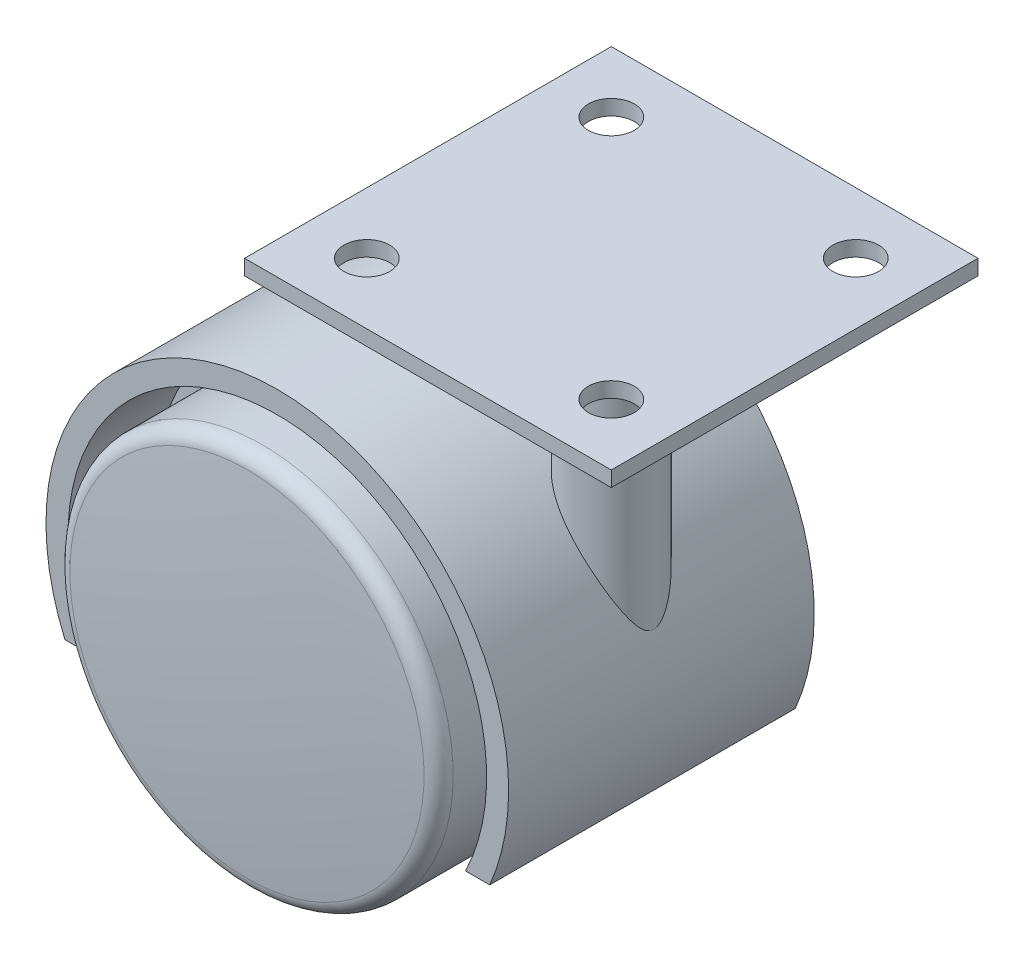
ISO-10303-21;
HEADER;
FILE_DESCRIPTION(('STEP AP214'),'2;1');
FILE_NAME('part.step','',(''),(''),'','','');
FILE_SCHEMA(('AUTOMOTIVE_DESIGN { 1 0 10303 214 1 1 1 1 }'));
ENDSEC;
DATA;
#1=APPLICATION_CONTEXT('core data for automotive mechanical design processes');
#2=APPLICATION_PROTOCOL_DEFINITION('international standard','automotive_design',2000,#1);
#3=PRODUCT_CONTEXT('',#1,'mechanical');
#4=PRODUCT('Part','Part','',(#3));
#5=PRODUCT_RELATED_PRODUCT_CATEGORY('part','',(#4));
#6=PRODUCT_DEFINITION_FORMATION('','',#4);
#7=PRODUCT_DEFINITION_CONTEXT('part definition',#1,'design');
#8=PRODUCT_DEFINITION('design','',#6,#7);
#9=PRODUCT_DEFINITION_SHAPE('','',#8);
#10=(LENGTH_UNIT() NAMED_UNIT(*) SI_UNIT(.MILLI.,.METRE.));
#11=(NAMED_UNIT(*) PLANE_ANGLE_UNIT() SI_UNIT($,.RADIAN.));
#12=(NAMED_UNIT(*) SI_UNIT($,.STERADIAN.) SOLID_ANGLE_UNIT());
#13=UNCERTAINTY_MEASURE_WITH_UNIT(LENGTH_MEASURE(1.E-05),#10,'distance_accuracy_value','');
#14=(GEOMETRIC_REPRESENTATION_CONTEXT(3) GLOBAL_UNCERTAINTY_ASSIGNED_CONTEXT((#13)) GLOBAL_UNIT_ASSIGNED_CONTEXT((#10,
#11,#12)) REPRESENTATION_CONTEXT('',''));
#15=CARTESIAN_POINT('',(0.,0.,0.));
#16=DIRECTION('',(0.,0.,1.));
#17=DIRECTION('',(1.,0.,0.));
#18=AXIS2_PLACEMENT_3D('',#15,#16,#17);
#19=CARTESIAN_POINT('',(0.,4.7625,-6.731));
#20=DIRECTION('',(0.,0.,-1.));
#21=DIRECTION('',(0.,1.,0.));
#22=AXIS2_PLACEMENT_3D('',#19,#20,#21);
#23=PLANE('',#22);
#24=CARTESIAN_POINT('',(0.,0.,-6.731));
#25=DIRECTION('',(0.,0.,-1.));
#26=DIRECTION('',(0.,1.,0.));
#27=AXIS2_PLACEMENT_3D('',#24,#25,#26);
#28=CIRCLE('',#27,21.74875);
#29=CARTESIAN_POINT('',(19.5520459687087,-9.52500000000001,-6.731));
#30=VERTEX_POINT('',#29);
#31=CARTESIAN_POINT('',(-19.5520459687088,-9.525,-6.731));
#32=VERTEX_POINT('',#31);
#33=EDGE_CURVE('E136',#30,#32,#28,.F.);
#34=ORIENTED_EDGE('',*,*,#33,.F.);
#35=DIRECTION('',(1.,0.,0.));
#36=VECTOR('',#35,1.);
#37=CARTESIAN_POINT('',(-19.5520459687088,-9.525,-6.731));
#38=LINE('',#37,#36);
#39=EDGE_CURVE('E129',#32,#30,#38,.T.);
#40=ORIENTED_EDGE('',*,*,#39,.F.);
#41=EDGE_LOOP('',(#34,#40));
#42=FACE_BOUND('',#41,.T.);
#43=CARTESIAN_POINT('',(0.,0.,-6.731));
#44=DIRECTION('',(0.,0.,-1.));
#45=DIRECTION('',(0.,1.,0.));
#46=AXIS2_PLACEMENT_3D('',#43,#44,#45);
#47=CIRCLE('',#46,4.7625);
#48=CARTESIAN_POINT('',(0.,4.7625,-6.731));
#49=VERTEX_POINT('',#48);
#50=EDGE_CURVE('E438',#49,#49,#47,.F.);
#51=ORIENTED_EDGE('',*,*,#50,.T.);
#52=EDGE_LOOP('',(#51));
#53=FACE_BOUND('',#52,.T.);
#54=ADVANCED_FACE('F48',(#42,#53),#23,.T.);
#55=CARTESIAN_POINT('',(0.,4.7625,6.731));
#56=DIRECTION('',(0.,0.,1.));
#57=DIRECTION('',(0.,-1.,0.));
#58=AXIS2_PLACEMENT_3D('',#55,#56,#57);
#59=PLANE('',#58);
#60=DIRECTION('',(1.,0.,0.));
#61=VECTOR('',#60,1.);
#62=CARTESIAN_POINT('',(-19.5520459687088,-9.525,6.731));
#63=LINE('',#62,#61);
#64=CARTESIAN_POINT('',(-19.5520459687088,-9.525,6.731));
#65=VERTEX_POINT('',#64);
#66=CARTESIAN_POINT('',(19.5520459687088,-9.52500000000001,6.731));
#67=VERTEX_POINT('',#66);
#68=EDGE_CURVE('E64',#65,#67,#63,.T.);
#69=ORIENTED_EDGE('',*,*,#68,.T.);
#70=CARTESIAN_POINT('',(0.,0.,6.731));
#71=DIRECTION('',(0.,0.,1.));
#72=DIRECTION('',(0.,-1.,0.));
#73=AXIS2_PLACEMENT_3D('',#70,#71,#72);
#74=CIRCLE('',#73,21.74875);
#75=EDGE_CURVE('E139',#67,#65,#74,.T.);
#76=ORIENTED_EDGE('',*,*,#75,.T.);
#77=EDGE_LOOP('',(#69,#76));
#78=FACE_BOUND('',#77,.T.);
#79=CARTESIAN_POINT('',(0.,0.,6.731));
#80=DIRECTION('',(0.,0.,1.));
#81=DIRECTION('',(0.,-1.,0.));
#82=AXIS2_PLACEMENT_3D('',#79,#80,#81);
#83=CIRCLE('',#82,4.7625);
#84=CARTESIAN_POINT('',(0.,-4.7625,6.731));
#85=VERTEX_POINT('',#84);
#86=EDGE_CURVE('E52',#85,#85,#83,.F.);
#87=ORIENTED_EDGE('',*,*,#86,.T.);
#88=EDGE_LOOP('',(#87));
#89=FACE_BOUND('',#88,.T.);
#90=ADVANCED_FACE('F172',(#78,#89),#59,.T.);
#91=CARTESIAN_POINT('',(18.82775,-19.84375,0.));
#92=DIRECTION('',(0.,-1.,0.));
#93=DIRECTION('',(0.,0.,-1.));
#94=AXIS2_PLACEMENT_3D('',#91,#92,#93);
#95=CYLINDRICAL_SURFACE('',#94,4.41325);
#96=CARTESIAN_POINT('',(18.82775,24.03475,0.));
#97=DIRECTION('',(0.,-1.,0.));
#98=DIRECTION('',(0.,0.,-1.));
#99=AXIS2_PLACEMENT_3D('',#96,#97,#98);
#100=CIRCLE('',#99,4.41325);
#101=CARTESIAN_POINT('',(18.82775,24.03475,-4.41325));
#102=VERTEX_POINT('',#101);
#103=EDGE_CURVE('E13',#102,#102,#100,.T.);
#104=ORIENTED_EDGE('',*,*,#103,.T.);
#105=EDGE_LOOP('',(#104));
#106=FACE_BOUND('',#105,.T.);
#107=CARTESIAN_POINT('',(18.82775,14.9393787521436,-4.41325));
#108=CARTESIAN_POINT('',(18.6735046556456,15.1337735249611,-4.41324708585515));
#109=CARTESIAN_POINT('',(18.516246833289,15.3257672803091,-4.4051749356869));
#110=CARTESIAN_POINT('',(18.1966337153172,15.703915800008,-4.37084755866677));
#111=CARTESIAN_POINT('',(18.0342779444308,15.8900700166975,-4.34459063165228));
#112=CARTESIAN_POINT('',(17.7064194757687,16.2545932862547,-4.27170982803758));
#113=CARTESIAN_POINT('',(17.5409273412617,16.4329834681052,-4.22514559635213));
#114=CARTESIAN_POINT('',(17.2085684956669,16.7807090296801,-4.10925552655094));
#115=CARTESIAN_POINT('',(17.0417028391793,16.9500507222742,-4.03994580492532));
#116=CARTESIAN_POINT('',(16.6774440408704,17.3092239499279,-3.86027477266318));
#117=CARTESIAN_POINT('',(16.4803349134141,17.4967549479172,-3.74458919594053));
#118=CARTESIAN_POINT('',(16.0953214371942,17.8515610490821,-3.47360247240316));
#119=CARTESIAN_POINT('',(15.9074068999939,18.0188588896441,-3.31834641521977));
#120=CARTESIAN_POINT('',(15.5795600222954,18.3026114624611,-2.9949761116742));
#121=CARTESIAN_POINT('',(15.4368166425068,18.4229036639546,-2.83316449610304));
#122=CARTESIAN_POINT('',(15.2377537278681,18.5872952816025,-2.56922086713555));
#123=CARTESIAN_POINT('',(15.1738814813439,18.6394388932609,-2.47765363539196));
#124=CARTESIAN_POINT('',(15.0520728218772,18.7379408534333,-2.28773753491972));
#125=CARTESIAN_POINT('',(14.9941337072346,18.78430183723,-2.18939178728408));
#126=CARTESIAN_POINT('',(14.8846359213459,18.8711885493543,-1.98548162594045));
#127=CARTESIAN_POINT('',(14.8331369031895,18.911660219609,-1.87986203430008));
#128=CARTESIAN_POINT('',(14.7380598081905,18.9858483437695,-1.66289714402008));
#129=CARTESIAN_POINT('',(14.6944776493467,19.0195682798503,-1.55155483427634));
#130=CARTESIAN_POINT('',(14.6160681970723,19.0798901471695,-1.3240046637402));
#131=CARTESIAN_POINT('',(14.5812377031941,19.1064946807109,-1.20779859979142));
#132=CARTESIAN_POINT('',(14.5210416806434,19.1522842454316,-0.971540599066324));
#133=CARTESIAN_POINT('',(14.495674538441,19.171470541463,-0.851489321704218));
#134=CARTESIAN_POINT('',(14.4578029201212,19.200042165769,-0.625737868752808));
#135=CARTESIAN_POINT('',(14.4439954579538,19.2104231235414,-0.520379568854183));
#136=CARTESIAN_POINT('',(14.4240135884359,19.2254310227401,-0.308538395085992));
#137=CARTESIAN_POINT('',(14.417838436075,19.230058525777,-0.202055632001834));
#138=CARTESIAN_POINT('',(14.4132267892254,19.2335152580596,0.0111285300789549));
#139=CARTESIAN_POINT('',(14.4147872619401,19.2323467596611,0.117829827000257));
#140=CARTESIAN_POINT('',(14.4256122070131,19.2242286042939,0.330617357755637));
#141=CARTESIAN_POINT('',(14.4348765238121,19.2172790640586,0.436703603965533));
#142=CARTESIAN_POINT('',(14.4600978824864,19.198307428978,0.640488369889694));
#143=CARTESIAN_POINT('',(14.4755756009996,19.1866483125453,0.738280308105837));
#144=CARTESIAN_POINT('',(14.512890100413,19.1584385503763,0.931934866181304));
#145=CARTESIAN_POINT('',(14.5347288955178,19.1418863552452,1.02779686463945));
#146=CARTESIAN_POINT('',(14.6093453984774,19.085077897831,1.31147061113141));
#147=CARTESIAN_POINT('',(14.6712487231738,19.0376509485245,1.49557013319889));
#148=CARTESIAN_POINT('',(14.8186278995268,18.9231711192496,1.85551132166329));
#149=CARTESIAN_POINT('',(14.9048506412693,18.8554913932126,2.03084098379151));
#150=CARTESIAN_POINT('',(15.0955907721381,18.7031340513818,2.36315267831197));
#151=CARTESIAN_POINT('',(15.2001141386345,18.6184508805735,2.52012868798925));
#152=CARTESIAN_POINT('',(15.4363746500406,18.4231833810191,2.83160667994795));
#153=CARTESIAN_POINT('',(15.5698707434623,18.3107143653123,2.98357983346428));
#154=CARTESIAN_POINT('',(15.8486649232616,18.0699459749271,3.26200886759862));
#155=CARTESIAN_POINT('',(15.993970938328,17.9416359347451,3.38844740353594));
#156=CARTESIAN_POINT('',(16.2572175440304,17.7029956114396,3.59026091241001));
#157=CARTESIAN_POINT('',(16.3737618513782,17.5953213724824,3.67069125042706));
#158=CARTESIAN_POINT('',(16.609244262768,17.3732093074563,3.81762652718935));
#159=CARTESIAN_POINT('',(16.7281833430695,17.2587686845998,3.88412565534085));
#160=CARTESIAN_POINT('',(16.9671087197422,17.0239401223274,4.00408424302384));
#161=CARTESIAN_POINT('',(17.0870963275903,16.9035434522117,4.05752383458586));
#162=CARTESIAN_POINT('',(17.3268003865907,16.6577518626752,4.15217228584777));
#163=CARTESIAN_POINT('',(17.4465167453595,16.5323554512051,4.1933774630288));
#164=CARTESIAN_POINT('',(17.7371931412647,16.2211060582015,4.28013175812443));
#165=CARTESIAN_POINT('',(17.907507060681,16.0329439159287,4.31960530522012));
#166=CARTESIAN_POINT('',(18.2435841090729,15.6494713576666,4.37774235603696));
#167=CARTESIAN_POINT('',(18.4093451949686,15.4541578213401,4.39639666129076));
#168=CARTESIAN_POINT('',(18.7352298899271,15.0574362411102,4.41530340572104));
#169=CARTESIAN_POINT('',(18.8953420355737,14.8560171915715,4.41552036093794));
#170=CARTESIAN_POINT('',(19.2086726228371,14.4486052621944,4.39957673731767));
#171=CARTESIAN_POINT('',(19.361891322382,14.2426125539174,4.38341677177943));
#172=CARTESIAN_POINT('',(19.7341935274965,13.725023162418,4.32504738390753));
#173=CARTESIAN_POINT('',(19.9487513174535,13.4111526993785,4.27395232328723));
#174=CARTESIAN_POINT('',(20.3603768422247,12.7776047638049,4.144204237535));
#175=CARTESIAN_POINT('',(20.5574341114991,12.4579239524245,4.06553485984841));
#176=CARTESIAN_POINT('',(20.9334104318532,11.8152433215256,3.88413397090499));
#177=CARTESIAN_POINT('',(21.1123470192469,11.4922470505717,3.78142604804404));
#178=CARTESIAN_POINT('',(21.452138917185,10.8447484330944,3.55403299113083));
#179=CARTESIAN_POINT('',(21.6130029924446,10.5202468967943,3.42935858627715));
#180=CARTESIAN_POINT('',(21.9024372204973,9.90239870024276,3.17129004768739));
#181=CARTESIAN_POINT('',(22.0326224314235,9.60900323294124,3.03983057108179));
#182=CARTESIAN_POINT('',(22.2168104132924,9.17102498840972,2.82838396560864));
#183=CARTESIAN_POINT('',(22.2763813967596,9.02532235377414,2.7554910164008));
#184=CARTESIAN_POINT('',(22.3917673886692,8.73512004893267,2.60453316890754));
#185=CARTESIAN_POINT('',(22.4475828024809,8.59062025037499,2.52646883062341));
#186=CARTESIAN_POINT('',(22.5546563539298,8.30539423471869,2.36561944160848));
#187=CARTESIAN_POINT('',(22.6059659102418,8.16464341227471,2.28291249961409));
#188=CARTESIAN_POINT('',(22.7047152434426,7.88587071180598,2.11086762126114));
#189=CARTESIAN_POINT('',(22.7521557828907,7.74784830011098,2.02153099823335));
#190=CARTESIAN_POINT('',(22.8428922450174,7.47609421147965,1.83472098362518));
#191=CARTESIAN_POINT('',(22.8861905211714,7.34236012714328,1.73725227203422));
#192=CARTESIAN_POINT('',(22.9681317805201,7.08185412532185,1.53175598942313));
#193=CARTESIAN_POINT('',(23.0067813952262,6.95507243397302,1.42374386755769));
#194=CARTESIAN_POINT('',(23.0716687038811,6.73630481125984,1.21472619030601));
#195=CARTESIAN_POINT('',(23.0988743908869,6.64225469532848,1.11621168716088));
#196=CARTESIAN_POINT('',(23.148241103756,6.46809006911075,0.906471098438803));
#197=CARTESIAN_POINT('',(23.1704248338218,6.38791324222358,0.795305782171558));
#198=CARTESIAN_POINT('',(23.1986367993613,6.28441663682708,0.613315538952055));
#199=CARTESIAN_POINT('',(23.2073558985194,6.25209232762389,0.548112050894086));
#200=CARTESIAN_POINT('',(23.2221126534048,6.19705544481058,0.413437801585636));
#201=CARTESIAN_POINT('',(23.2281533145724,6.17433209944064,0.343971923294372));
#202=CARTESIAN_POINT('',(23.2370051219257,6.1409381862706,0.201024100747497));
#203=CARTESIAN_POINT('',(23.2397777125584,6.13041153496878,0.127504717920411));
#204=CARTESIAN_POINT('',(23.2415704113623,6.12361257247875,-0.0202333032987582));
#205=CARTESIAN_POINT('',(23.240592632916,6.12733223330368,-0.0944515243699879));
#206=CARTESIAN_POINT('',(23.2353927044882,6.14701598750995,-0.231460702791826));
#207=CARTESIAN_POINT('',(23.231595176716,6.16137706528976,-0.294512563987838));
#208=CARTESIAN_POINT('',(23.2216213836058,6.19886166448413,-0.417727269934083));
#209=CARTESIAN_POINT('',(23.2154434630873,6.22199128282837,-0.477888071606195));
#210=CARTESIAN_POINT('',(23.196029351772,6.29409316649939,-0.636483644814266));
#211=CARTESIAN_POINT('',(23.1809014800182,6.34973203276506,-0.731618378718731));
#212=CARTESIAN_POINT('',(23.146615133682,6.47360743279918,-0.91253199997619));
#213=CARTESIAN_POINT('',(23.127440848687,6.54189324957195,-0.998272122762543));
#214=CARTESIAN_POINT('',(23.0781239881532,6.71417776416624,-1.19366124485248));
#215=CARTESIAN_POINT('',(23.046607003352,6.82177642190884,-1.29973706844399));
#216=CARTESIAN_POINT('',(22.9792132428516,7.04547642062725,-1.50112727724001));
#217=CARTESIAN_POINT('',(22.9433270670316,7.16159587277434,-1.59641757726972));
#218=CARTESIAN_POINT('',(22.8676886916121,7.39957392441207,-1.77918089434151));
#219=CARTESIAN_POINT('',(22.8279177445438,7.52145872662259,-1.86661165475473));
#220=CARTESIAN_POINT('',(22.7450510581194,7.76845117350367,-2.0347714422303));
#221=CARTESIAN_POINT('',(22.7019583597574,7.89355580219871,-2.11550646175837));
#222=CARTESIAN_POINT('',(22.6084726535722,8.15766921962945,-2.27871725269993));
#223=CARTESIAN_POINT('',(22.5577730102324,8.29689466778999,-2.36066461388693));
#224=CARTESIAN_POINT('',(22.4527165132197,8.57712865568059,-2.51901072099522));
#225=CARTESIAN_POINT('',(22.3983590131114,8.7181375069883,-2.59540848117542));
#226=CARTESIAN_POINT('',(22.2860185986749,9.00143437589353,-2.74331625160566));
#227=CARTESIAN_POINT('',(22.2280326906449,9.14372336457318,-2.81482212110257));
#228=CARTESIAN_POINT('',(22.108512695191,9.4290409289626,-2.95325683149179));
#229=CARTESIAN_POINT('',(22.0469782993801,9.57206956796656,-3.02018527346733));
#230=CARTESIAN_POINT('',(21.8572851371132,10.0012993100498,-3.21425599161849));
#231=CARTESIAN_POINT('',(21.7238444072443,10.2881303913823,-3.33493430323479));
#232=CARTESIAN_POINT('',(21.4429955457411,10.8613556233049,-3.55942819307869));
#233=CARTESIAN_POINT('',(21.2955930654092,11.1477499034054,-3.66325054830291));
#234=CARTESIAN_POINT('',(20.9786800756637,11.7337479863459,-3.8583268812047));
#235=CARTESIAN_POINT('',(20.8084169416365,12.0332603664727,-3.94864107549391));
#236=CARTESIAN_POINT('',(20.452393039811,12.6289047844972,-4.10796132247876));
#237=CARTESIAN_POINT('',(20.2666277291247,12.9250358023854,-4.17696110097029));
#238=CARTESIAN_POINT('',(19.8801077342747,13.5119924329223,-4.29067423135269));
#239=CARTESIAN_POINT('',(19.6793606663886,13.8028206490387,-4.33539982912617));
#240=CARTESIAN_POINT('',(19.2637164272811,14.3772002334457,-4.39668168207125));
#241=CARTESIAN_POINT('',(19.0488274878805,14.6607557038341,-4.41325417679915));
#242=CARTESIAN_POINT('',(18.82775,14.9393787521436,-4.41325));
#243=B_SPLINE_CURVE_WITH_KNOTS('',3,(#107,#108,#109,#110,#111,#112,#113,#114,#115,#116,#117,
#118,#119,#120,#121,#122,#123,#124,#125,#126,#127,#128,#129,#130,#131,#132,#133,#134,#135,#136,
#137,#138,#139,#140,#141,#142,#143,#144,#145,#146,#147,#148,#149,#150,#151,#152,#153,#154,#155,
#156,#157,#158,#159,#160,#161,#162,#163,#164,#165,#166,#167,#168,#169,#170,#171,#172,#173,#174,
#175,#176,#177,#178,#179,#180,#181,#182,#183,#184,#185,#186,#187,#188,#189,#190,#191,#192,#193,
#194,#195,#196,#197,#198,#199,#200,#201,#202,#203,#204,#205,#206,#207,#208,#209,#210,#211,#212,
#213,#214,#215,#216,#217,#218,#219,#220,#221,#222,#223,#224,#225,#226,#227,#228,#229,#230,#231,
#232,#233,#234,#235,#236,#237,#238,#239,#240,#241,#242),.UNSPECIFIED.,.T.,.F.,(4,2,2,2,2,2,2,2,
2,2,2,2,2,2,2,2,2,2,2,2,2,2,2,2,2,2,2,2,2,2,2,2,2,2,2,2,2,2,2,2,2,2,2,2,2,2,2,2,2,2,2,2,2,2,2,2,
2,2,2,2,2,2,2,2,2,2,2,4),(0.,0.744251312582461,1.48857221739132,2.23072153529336,
2.9723461289421,3.85622891715674,4.73910900973971,5.4769461094851,5.84621401019567,
6.21531300695934,6.58761106372584,6.95971661212676,7.33168588437778,7.70359170573537,
8.02346886869531,8.34331480511575,8.66303535400623,8.98274944711571,9.281473603671,
9.58029245282045,10.1773299342115,10.7951918603671,11.4132559710161,12.1050476657429,
12.7973076989624,13.3302840657739,13.8634822920197,14.3974867125313,14.9316517040674,
15.7010096040289,16.4707072913575,17.2418862818158,18.0130363934765,19.1621567156981,
20.3119596635301,21.460639035507,22.6087588998165,23.6484785887845,24.1687874062446,
24.6890399721231,25.2022575587527,25.7153737476874,26.2281966503789,26.7402790875989,
27.1562317684956,27.5702646087306,27.7895407594241,28.0085702366831,28.2301586759143,
28.4516222654821,28.6451618911689,28.8388363361201,29.1706230408672,29.5037309563105,
29.9656314866948,30.4285439443826,30.8938125141582,31.3586600866255,31.8664581455693,
32.3743461820807,32.8826589345173,33.3910159294398,34.4059943473706,35.420563673646,
36.488128828784,37.5560079382396,38.6233478201676,39.6900718190421),.UNSPECIFIED.);
#244=CARTESIAN_POINT('',(18.82775,14.9393787521436,-4.41325));
#245=VERTEX_POINT('',#244);
#246=EDGE_CURVE('E126',#245,#245,#243,.T.);
#247=ORIENTED_EDGE('',*,*,#246,.T.);
#248=EDGE_LOOP('',(#247));
#249=FACE_BOUND('',#248,.T.);
#250=ADVANCED_FACE('F159',(#106,#249),#95,.T.);
#251=CARTESIAN_POINT('',(18.82775,35.71875,0.));
#252=DIRECTION('',(0.,1.,0.));
#253=DIRECTION('',(0.,0.,1.));
#254=AXIS2_PLACEMENT_3D('',#251,#252,#253);
#255=PLANE('',#254);
#256=CARTESIAN_POINT('',(18.82775,35.71875,0.));
#257=DIRECTION('',(0.,-1.,0.));
#258=DIRECTION('',(0.,0.,-1.));
#259=AXIS2_PLACEMENT_3D('',#256,#257,#258);
#260=CIRCLE('',#259,11.684);
#261=CARTESIAN_POINT('',(18.82775,35.71875,-11.684));
#262=VERTEX_POINT('',#261);
#263=EDGE_CURVE('E141',#262,#262,#260,.T.);
#264=ORIENTED_EDGE('',*,*,#263,.F.);
#265=EDGE_LOOP('',(#264));
#266=FACE_BOUND('',#265,.T.);
#267=ADVANCED_FACE('F50',(#266),#255,.T.);
#268=CARTESIAN_POINT('',(22.89175,24.03475,0.));
#269=DIRECTION('',(0.,1.,0.));
#270=DIRECTION('',(0.,0.,1.));
#271=AXIS2_PLACEMENT_3D('',#268,#269,#270);
#272=PLANE('',#271);
#273=CARTESIAN_POINT('',(18.82775,24.03475,0.));
#274=DIRECTION('',(0.,-1.,0.));
#275=DIRECTION('',(0.,0.,-1.));
#276=AXIS2_PLACEMENT_3D('',#273,#274,#275);
#277=CIRCLE('',#276,4.064);
#278=CARTESIAN_POINT('',(18.82775,24.03475,-4.064));
#279=VERTEX_POINT('',#278);
#280=EDGE_CURVE('E57',#279,#279,#277,.T.);
#281=ORIENTED_EDGE('',*,*,#280,.T.);
#282=EDGE_LOOP('',(#281));
#283=FACE_BOUND('',#282,.T.);
#284=ORIENTED_EDGE('',*,*,#103,.F.);
#285=EDGE_LOOP('',(#284));
#286=FACE_BOUND('',#285,.T.);
#287=ADVANCED_FACE('F194',(#283,#286),#272,.T.);
#288=CARTESIAN_POINT('',(18.82775,-19.84375,0.));
#289=DIRECTION('',(0.,-1.,0.));
#290=DIRECTION('',(0.,0.,-1.));
#291=AXIS2_PLACEMENT_3D('',#288,#289,#290);
#292=CYLINDRICAL_SURFACE('',#291,4.064);
#293=CARTESIAN_POINT('',(18.82775,28.83535,0.));
#294=DIRECTION('',(0.,-1.,0.));
#295=DIRECTION('',(0.,0.,-1.));
#296=AXIS2_PLACEMENT_3D('',#293,#294,#295);
#297=CIRCLE('',#296,4.064);
#298=CARTESIAN_POINT('',(18.82775,28.83535,-4.064));
#299=VERTEX_POINT('',#298);
#300=EDGE_CURVE('E151',#299,#299,#297,.T.);
#301=ORIENTED_EDGE('',*,*,#300,.T.);
#302=EDGE_LOOP('',(#301));
#303=FACE_BOUND('',#302,.T.);
#304=ORIENTED_EDGE('',*,*,#280,.F.);
#305=EDGE_LOOP('',(#304));
#306=FACE_BOUND('',#305,.T.);
#307=ADVANCED_FACE('F191',(#303,#306),#292,.T.);
#308=CARTESIAN_POINT('',(22.89175,28.83535,0.));
#309=DIRECTION('',(0.,-1.,0.));
#310=DIRECTION('',(0.,0.,-1.));
#311=AXIS2_PLACEMENT_3D('',#308,#309,#310);
#312=PLANE('',#311);
#313=CARTESIAN_POINT('',(18.82775,28.83535,0.));
#314=DIRECTION('',(0.,-1.,0.));
#315=DIRECTION('',(0.,0.,-1.));
#316=AXIS2_PLACEMENT_3D('',#313,#314,#315);
#317=CIRCLE('',#316,5.1054);
#318=CARTESIAN_POINT('',(18.82775,28.83535,-5.1054));
#319=VERTEX_POINT('',#318);
#320=EDGE_CURVE('E148',#319,#319,#317,.T.);
#321=ORIENTED_EDGE('',*,*,#320,.T.);
#322=EDGE_LOOP('',(#321));
#323=FACE_BOUND('',#322,.T.);
#324=ORIENTED_EDGE('',*,*,#300,.F.);
#325=EDGE_LOOP('',(#324));
#326=FACE_BOUND('',#325,.T.);
#327=ADVANCED_FACE('F187',(#323,#326),#312,.T.);
#328=CARTESIAN_POINT('',(18.82775,30.81655,0.));
#329=DIRECTION('',(0.,-1.,0.));
#330=DIRECTION('',(0.,0.,-1.));
#331=AXIS2_PLACEMENT_3D('',#328,#329,#330);
#332=DEGENERATE_TOROIDAL_SURFACE('',#331,0.643393043478234,4.8820753292067,.T.);
#333=CARTESIAN_POINT('',(18.82775,32.79775,0.));
#334=DIRECTION('',(0.,-1.,0.));
#335=DIRECTION('',(0.,0.,-1.));
#336=AXIS2_PLACEMENT_3D('',#333,#334,#335);
#337=CIRCLE('',#336,5.1054);
#338=CARTESIAN_POINT('',(18.82775,32.79775,-5.1054));
#339=VERTEX_POINT('',#338);
#340=EDGE_CURVE('E145',#339,#339,#337,.T.);
#341=ORIENTED_EDGE('',*,*,#340,.T.);
#342=EDGE_LOOP('',(#341));
#343=FACE_BOUND('',#342,.T.);
#344=ORIENTED_EDGE('',*,*,#320,.F.);
#345=EDGE_LOOP('',(#344));
#346=FACE_BOUND('',#345,.T.);
#347=ADVANCED_FACE('F183',(#343,#346),#332,.T.);
#348=CARTESIAN_POINT('',(18.82775,32.79775,0.));
#349=DIRECTION('',(0.,1.,0.));
#350=DIRECTION('',(0.,0.,1.));
#351=AXIS2_PLACEMENT_3D('',#348,#349,#350);
#352=CONICAL_SURFACE('',#351,5.1054,1.15293029171843);
#353=ORIENTED_EDGE('',*,*,#263,.T.);
#354=EDGE_LOOP('',(#353));
#355=FACE_BOUND('',#354,.T.);
#356=ORIENTED_EDGE('',*,*,#340,.F.);
#357=EDGE_LOOP('',(#356));
#358=FACE_BOUND('',#357,.T.);
#359=ADVANCED_FACE('F180',(#355,#358),#352,.T.);
#360=CARTESIAN_POINT('',(0.,0.,15.875));
#361=DIRECTION('',(0.,0.,-1.));
#362=DIRECTION('',(-1.,0.,0.));
#363=AXIS2_PLACEMENT_3D('',#360,#361,#362);
#364=CYLINDRICAL_SURFACE('',#363,21.74875);
#365=ORIENTED_EDGE('',*,*,#75,.F.);
#366=DIRECTION('',(0.,0.,-1.));
#367=VECTOR('',#366,1.);
#368=CARTESIAN_POINT('',(19.5520459687087,-9.52500000000001,15.875));
#369=LINE('',#368,#367);
#370=CARTESIAN_POINT('',(19.5520459687087,-9.52500000000001,15.875));
#371=VERTEX_POINT('',#370);
#372=EDGE_CURVE('E452',#371,#67,#369,.T.);
#373=ORIENTED_EDGE('',*,*,#372,.F.);
#374=CARTESIAN_POINT('',(0.,0.,15.875));
#375=DIRECTION('',(0.,0.,-1.));
#376=DIRECTION('',(1.,0.,0.));
#377=AXIS2_PLACEMENT_3D('',#374,#375,#376);
#378=CIRCLE('',#377,21.74875);
#379=CARTESIAN_POINT('',(-19.5520459687088,-9.525,15.875));
#380=VERTEX_POINT('',#379);
#381=EDGE_CURVE('E111',#380,#371,#378,.T.);
#382=ORIENTED_EDGE('',*,*,#381,.F.);
#383=DIRECTION('',(0.,0.,-1.));
#384=VECTOR('',#383,1.);
#385=CARTESIAN_POINT('',(-19.5520459687088,-9.525,15.875));
#386=LINE('',#385,#384);
#387=EDGE_CURVE('E108',#380,#65,#386,.T.);
#388=ORIENTED_EDGE('',*,*,#387,.T.);
#389=EDGE_LOOP('',(#365,#373,#382,#388));
#390=FACE_BOUND('',#389,.T.);
#391=ADVANCED_FACE('F167',(#390),#364,.F.);
#392=CARTESIAN_POINT('',(0.,0.,15.875));
#393=DIRECTION('',(0.,0.,-1.));
#394=DIRECTION('',(-1.,0.,0.));
#395=AXIS2_PLACEMENT_3D('',#392,#393,#394);
#396=CYLINDRICAL_SURFACE('',#395,24.03475);
#397=ORIENTED_EDGE('',*,*,#246,.F.);
#398=EDGE_LOOP('',(#397));
#399=FACE_BOUND('',#398,.T.);
#400=CARTESIAN_POINT('',(0.,0.,-15.875));
#401=DIRECTION('',(0.,0.,1.));
#402=DIRECTION('',(1.,0.,0.));
#403=AXIS2_PLACEMENT_3D('',#400,#401,#402);
#404=CIRCLE('',#403,24.03475);
#405=CARTESIAN_POINT('',(22.0667981946294,-9.525,-15.875));
#406=VERTEX_POINT('',#405);
#407=CARTESIAN_POINT('',(-22.0667981946294,-9.52499999999997,-15.875));
#408=VERTEX_POINT('',#407);
#409=EDGE_CURVE('E125',#406,#408,#404,.T.);
#410=ORIENTED_EDGE('',*,*,#409,.T.);
#411=DIRECTION('',(0.,0.,-1.));
#412=VECTOR('',#411,1.);
#413=CARTESIAN_POINT('',(-22.0667981946294,-9.52499999999997,15.875));
#414=LINE('',#413,#412);
#415=CARTESIAN_POINT('',(-22.0667981946294,-9.52499999999997,15.875));
#416=VERTEX_POINT('',#415);
#417=EDGE_CURVE('E105',#416,#408,#414,.T.);
#418=ORIENTED_EDGE('',*,*,#417,.F.);
#419=CARTESIAN_POINT('',(0.,0.,15.875));
#420=DIRECTION('',(0.,0.,1.));
#421=DIRECTION('',(1.,0.,0.));
#422=AXIS2_PLACEMENT_3D('',#419,#420,#421);
#423=CIRCLE('',#422,24.03475);
#424=CARTESIAN_POINT('',(22.0667981946294,-9.525,15.875));
#425=VERTEX_POINT('',#424);
#426=EDGE_CURVE('E112',#425,#416,#423,.T.);
#427=ORIENTED_EDGE('',*,*,#426,.F.);
#428=DIRECTION('',(0.,0.,-1.));
#429=VECTOR('',#428,1.);
#430=CARTESIAN_POINT('',(22.0667981946294,-9.525,15.875));
#431=LINE('',#430,#429);
#432=EDGE_CURVE('E443',#425,#406,#431,.T.);
#433=ORIENTED_EDGE('',*,*,#432,.T.);
#434=EDGE_LOOP('',(#410,#418,#427,#433));
#435=FACE_BOUND('',#434,.T.);
#436=ADVANCED_FACE('F123',(#399,#435),#396,.T.);
#437=ORIENTED_EDGE('',*,*,#33,.T.);
#438=CARTESIAN_POINT('',(-19.5520459687088,-9.525,-15.875));
#439=VERTEX_POINT('',#438);
#440=EDGE_CURVE('E130',#32,#439,#386,.T.);
#441=ORIENTED_EDGE('',*,*,#440,.T.);
#442=CARTESIAN_POINT('',(0.,0.,-15.875));
#443=DIRECTION('',(0.,0.,-1.));
#444=DIRECTION('',(1.,0.,0.));
#445=AXIS2_PLACEMENT_3D('',#442,#443,#444);
#446=CIRCLE('',#445,21.74875);
#447=CARTESIAN_POINT('',(19.5520459687087,-9.52500000000001,-15.875));
#448=VERTEX_POINT('',#447);
#449=EDGE_CURVE('E447',#439,#448,#446,.T.);
#450=ORIENTED_EDGE('',*,*,#449,.T.);
#451=EDGE_CURVE('E451',#30,#448,#369,.T.);
#452=ORIENTED_EDGE('',*,*,#451,.F.);
#453=EDGE_LOOP('',(#437,#441,#450,#452));
#454=FACE_BOUND('',#453,.T.);
#455=ADVANCED_FACE('F166',(#454),#364,.F.);
#456=CARTESIAN_POINT('',(0.,0.,15.875));
#457=DIRECTION('',(0.,0.,1.));
#458=DIRECTION('',(1.,0.,0.));
#459=AXIS2_PLACEMENT_3D('',#456,#457,#458);
#460=PLANE('',#459);
#461=ORIENTED_EDGE('',*,*,#426,.T.);
#462=DIRECTION('',(1.,0.,0.));
#463=VECTOR('',#462,1.);
#464=CARTESIAN_POINT('',(-22.0667981946294,-9.52499999999997,15.875));
#465=LINE('',#464,#463);
#466=EDGE_CURVE('E100',#416,#380,#465,.T.);
#467=ORIENTED_EDGE('',*,*,#466,.T.);
#468=ORIENTED_EDGE('',*,*,#381,.T.);
#469=DIRECTION('',(1.,0.,0.));
#470=VECTOR('',#469,1.);
#471=CARTESIAN_POINT('',(19.5520459687087,-9.52500000000001,15.875));
#472=LINE('',#471,#470);
#473=EDGE_CURVE('E117',#371,#425,#472,.T.);
#474=ORIENTED_EDGE('',*,*,#473,.T.);
#475=EDGE_LOOP('',(#461,#467,#468,#474));
#476=FACE_BOUND('',#475,.T.);
#477=ADVANCED_FACE('F115',(#476),#460,.T.);
#478=CARTESIAN_POINT('',(0.,0.,-15.875));
#479=DIRECTION('',(0.,0.,1.));
#480=DIRECTION('',(1.,0.,0.));
#481=AXIS2_PLACEMENT_3D('',#478,#479,#480);
#482=PLANE('',#481);
#483=ORIENTED_EDGE('',*,*,#409,.F.);
#484=DIRECTION('',(1.,0.,0.));
#485=VECTOR('',#484,1.);
#486=CARTESIAN_POINT('',(19.5520459687087,-9.52500000000001,-15.875));
#487=LINE('',#486,#485);
#488=EDGE_CURVE('E121',#448,#406,#487,.T.);
#489=ORIENTED_EDGE('',*,*,#488,.F.);
#490=ORIENTED_EDGE('',*,*,#449,.F.);
#491=DIRECTION('',(1.,0.,0.));
#492=VECTOR('',#491,1.);
#493=CARTESIAN_POINT('',(-22.0667981946294,-9.52499999999997,-15.875));
#494=LINE('',#493,#492);
#495=EDGE_CURVE('E445',#408,#439,#494,.T.);
#496=ORIENTED_EDGE('',*,*,#495,.F.);
#497=EDGE_LOOP('',(#483,#489,#490,#496));
#498=FACE_BOUND('',#497,.T.);
#499=ADVANCED_FACE('F177',(#498),#482,.F.);
#500=CARTESIAN_POINT('',(-19.5520459687088,-9.525,62.8441270817049));
#501=DIRECTION('',(0.,1.,0.));
#502=DIRECTION('',(-1.,0.,0.));
#503=AXIS2_PLACEMENT_3D('',#500,#501,#502);
#504=PLANE('',#503);
#505=ORIENTED_EDGE('',*,*,#68,.F.);
#506=ORIENTED_EDGE('',*,*,#387,.F.);
#507=ORIENTED_EDGE('',*,*,#466,.F.);
#508=ORIENTED_EDGE('',*,*,#417,.T.);
#509=ORIENTED_EDGE('',*,*,#495,.T.);
#510=ORIENTED_EDGE('',*,*,#440,.F.);
#511=ORIENTED_EDGE('',*,*,#39,.T.);
#512=ORIENTED_EDGE('',*,*,#451,.T.);
#513=ORIENTED_EDGE('',*,*,#488,.T.);
#514=ORIENTED_EDGE('',*,*,#432,.F.);
#515=ORIENTED_EDGE('',*,*,#473,.F.);
#516=ORIENTED_EDGE('',*,*,#372,.T.);
#517=EDGE_LOOP('',(#505,#506,#507,#508,#509,#510,#511,#512,#513,#514,#515,#516));
#518=FACE_BOUND('',#517,.T.);
#519=ADVANCED_FACE('F102',(#518),#504,.F.);
#520=CARTESIAN_POINT('',(0.,0.,-187.338229166666));
#521=DIRECTION('',(0.,0.,1.));
#522=DIRECTION('',(0.,1.,0.));
#523=AXIS2_PLACEMENT_3D('',#520,#521,#522);
#524=SPHERICAL_SURFACE('',#523,207.181979166666);
#525=CARTESIAN_POINT('',(0.,0.,19.0253212511247));
#526=DIRECTION('',(0.,0.,1.));
#527=DIRECTION('',(0.,-1.,0.));
#528=AXIS2_PLACEMENT_3D('',#525,#526,#527);
#529=CIRCLE('',#528,18.3972158323145);
#530=CARTESIAN_POINT('',(0.,-18.3972158323145,19.0253212511247));
#531=VERTEX_POINT('',#530);
#532=EDGE_CURVE('E475',#531,#531,#529,.T.);
#533=ORIENTED_EDGE('',*,*,#532,.T.);
#534=EDGE_LOOP('',(#533));
#535=FACE_BOUND('',#534,.T.);
#536=ADVANCED_FACE('F176',(#535),#524,.T.);
#537=CARTESIAN_POINT('',(0.,0.,17.4440923353381));
#538=DIRECTION('',(0.,0.,1.));
#539=DIRECTION('',(0.,-1.,0.));
#540=AXIS2_PLACEMENT_3D('',#537,#538,#539);
#541=TOROIDAL_SURFACE('',#540,18.25625,1.58749999999998);
#542=ORIENTED_EDGE('',*,*,#532,.F.);
#543=EDGE_LOOP('',(#542));
#544=FACE_BOUND('',#543,.T.);
#545=CARTESIAN_POINT('',(0.,0.,17.4440923353381));
#546=DIRECTION('',(0.,0.,1.));
#547=DIRECTION('',(0.,-1.,0.));
#548=AXIS2_PLACEMENT_3D('',#545,#546,#547);
#549=CIRCLE('',#548,19.84375);
#550=CARTESIAN_POINT('',(0.,-19.84375,17.4440923353381));
#551=VERTEX_POINT('',#550);
#552=EDGE_CURVE('E470',#551,#551,#549,.T.);
#553=ORIENTED_EDGE('',*,*,#552,.T.);
#554=EDGE_LOOP('',(#553));
#555=FACE_BOUND('',#554,.T.);
#556=ADVANCED_FACE('F311',(#544,#555),#541,.T.);
#557=CARTESIAN_POINT('',(0.,0.,19.84375));
#558=DIRECTION('',(0.,0.,1.));
#559=DIRECTION('',(0.,-1.,0.));
#560=AXIS2_PLACEMENT_3D('',#557,#558,#559);
#561=CYLINDRICAL_SURFACE('',#560,19.84375);
#562=ORIENTED_EDGE('',*,*,#552,.F.);
#563=EDGE_LOOP('',(#562));
#564=FACE_BOUND('',#563,.T.);
#565=CARTESIAN_POINT('',(0.,0.,9.271));
#566=DIRECTION('',(0.,0.,1.));
#567=DIRECTION('',(0.,-1.,0.));
#568=AXIS2_PLACEMENT_3D('',#565,#566,#567);
#569=CIRCLE('',#568,19.84375);
#570=CARTESIAN_POINT('',(0.,-19.84375,9.271));
#571=VERTEX_POINT('',#570);
#572=EDGE_CURVE('E468',#571,#571,#569,.T.);
#573=ORIENTED_EDGE('',*,*,#572,.T.);
#574=EDGE_LOOP('',(#573));
#575=FACE_BOUND('',#574,.T.);
#576=ADVANCED_FACE('F323',(#564,#575),#561,.T.);
#577=CARTESIAN_POINT('',(0.,4.7625,9.271));
#578=DIRECTION('',(0.,0.,1.));
#579=DIRECTION('',(0.,-1.,0.));
#580=AXIS2_PLACEMENT_3D('',#577,#578,#579);
#581=PLANE('',#580);
#582=ORIENTED_EDGE('',*,*,#572,.F.);
#583=EDGE_LOOP('',(#582));
#584=FACE_BOUND('',#583,.T.);
#585=CARTESIAN_POINT('',(0.,0.,9.271));
#586=DIRECTION('',(0.,0.,1.));
#587=DIRECTION('',(0.,-1.,0.));
#588=AXIS2_PLACEMENT_3D('',#585,#586,#587);
#589=CIRCLE('',#588,4.7625);
#590=CARTESIAN_POINT('',(0.,-4.7625,9.271));
#591=VERTEX_POINT('',#590);
#592=EDGE_CURVE('E432',#591,#591,#589,.T.);
#593=ORIENTED_EDGE('',*,*,#592,.T.);
#594=EDGE_LOOP('',(#593));
#595=FACE_BOUND('',#594,.T.);
#596=ADVANCED_FACE('F333',(#584,#595),#581,.F.);
#597=CARTESIAN_POINT('',(0.,0.,19.84375));
#598=DIRECTION('',(0.,0.,1.));
#599=DIRECTION('',(0.,-1.,0.));
#600=AXIS2_PLACEMENT_3D('',#597,#598,#599);
#601=CYLINDRICAL_SURFACE('',#600,4.7625);
#602=ORIENTED_EDGE('',*,*,#86,.F.);
#603=EDGE_LOOP('',(#602));
#604=FACE_BOUND('',#603,.T.);
#605=ORIENTED_EDGE('',*,*,#592,.F.);
#606=EDGE_LOOP('',(#605));
#607=FACE_BOUND('',#606,.T.);
#608=ADVANCED_FACE('F343',(#604,#607),#601,.T.);
#609=ORIENTED_EDGE('',*,*,#50,.F.);
#610=EDGE_LOOP('',(#609));
#611=FACE_BOUND('',#610,.T.);
#612=CARTESIAN_POINT('',(0.,0.,-9.271));
#613=DIRECTION('',(0.,0.,1.));
#614=DIRECTION('',(0.,-1.,0.));
#615=AXIS2_PLACEMENT_3D('',#612,#613,#614);
#616=CIRCLE('',#615,4.7625);
#617=CARTESIAN_POINT('',(0.,-4.7625,-9.271));
#618=VERTEX_POINT('',#617);
#619=EDGE_CURVE('E423',#618,#618,#616,.T.);
#620=ORIENTED_EDGE('',*,*,#619,.T.);
#621=EDGE_LOOP('',(#620));
#622=FACE_BOUND('',#621,.T.);
#623=ADVANCED_FACE('F353',(#611,#622),#601,.T.);
#624=CARTESIAN_POINT('',(0.,0.,187.338229166666));
#625=DIRECTION('',(0.,0.,1.));
#626=DIRECTION('',(0.,1.,0.));
#627=AXIS2_PLACEMENT_3D('',#624,#625,#626);
#628=SPHERICAL_SURFACE('',#627,207.181979166666);
#629=CARTESIAN_POINT('',(0.,0.,-19.0253212511247));
#630=DIRECTION('',(0.,0.,1.));
#631=DIRECTION('',(0.,-1.,0.));
#632=AXIS2_PLACEMENT_3D('',#629,#630,#631);
#633=CIRCLE('',#632,18.3972158323146);
#634=CARTESIAN_POINT('',(0.,-18.3972158323146,-19.0253212511247));
#635=VERTEX_POINT('',#634);
#636=EDGE_CURVE('E430',#635,#635,#633,.T.);
#637=ORIENTED_EDGE('',*,*,#636,.F.);
#638=EDGE_LOOP('',(#637));
#639=FACE_BOUND('',#638,.T.);
#640=ADVANCED_FACE('F363',(#639),#628,.T.);
#641=CARTESIAN_POINT('',(0.,0.,-17.4440923353381));
#642=DIRECTION('',(0.,0.,1.));
#643=DIRECTION('',(0.,-1.,0.));
#644=AXIS2_PLACEMENT_3D('',#641,#642,#643);
#645=TOROIDAL_SURFACE('',#644,18.25625,1.58749999999998);
#646=CARTESIAN_POINT('',(0.,0.,-17.4440923353381));
#647=DIRECTION('',(0.,0.,1.));
#648=DIRECTION('',(0.,-1.,0.));
#649=AXIS2_PLACEMENT_3D('',#646,#647,#648);
#650=CIRCLE('',#649,19.84375);
#651=CARTESIAN_POINT('',(0.,-19.84375,-17.4440923353381));
#652=VERTEX_POINT('',#651);
#653=EDGE_CURVE('E427',#652,#652,#650,.T.);
#654=ORIENTED_EDGE('',*,*,#653,.F.);
#655=EDGE_LOOP('',(#654));
#656=FACE_BOUND('',#655,.T.);
#657=ORIENTED_EDGE('',*,*,#636,.T.);
#658=EDGE_LOOP('',(#657));
#659=FACE_BOUND('',#658,.T.);
#660=ADVANCED_FACE('F372',(#656,#659),#645,.T.);
#661=CARTESIAN_POINT('',(0.,0.,19.84375));
#662=DIRECTION('',(0.,0.,1.));
#663=DIRECTION('',(0.,-1.,0.));
#664=AXIS2_PLACEMENT_3D('',#661,#662,#663);
#665=CYLINDRICAL_SURFACE('',#664,19.84375);
#666=CARTESIAN_POINT('',(0.,0.,-9.271));
#667=DIRECTION('',(0.,0.,1.));
#668=DIRECTION('',(0.,-1.,0.));
#669=AXIS2_PLACEMENT_3D('',#666,#667,#668);
#670=CIRCLE('',#669,19.84375);
#671=CARTESIAN_POINT('',(0.,-19.84375,-9.271));
#672=VERTEX_POINT('',#671);
#673=EDGE_CURVE('E426',#672,#672,#670,.T.);
#674=ORIENTED_EDGE('',*,*,#673,.F.);
#675=EDGE_LOOP('',(#674));
#676=FACE_BOUND('',#675,.T.);
#677=ORIENTED_EDGE('',*,*,#653,.T.);
#678=EDGE_LOOP('',(#677));
#679=FACE_BOUND('',#678,.T.);
#680=ADVANCED_FACE('F382',(#676,#679),#665,.T.);
#681=CARTESIAN_POINT('',(0.,4.7625,-9.271));
#682=DIRECTION('',(0.,0.,-1.));
#683=DIRECTION('',(0.,1.,0.));
#684=AXIS2_PLACEMENT_3D('',#681,#682,#683);
#685=PLANE('',#684);
#686=ORIENTED_EDGE('',*,*,#619,.F.);
#687=EDGE_LOOP('',(#686));
#688=FACE_BOUND('',#687,.T.);
#689=ORIENTED_EDGE('',*,*,#673,.T.);
#690=EDGE_LOOP('',(#689));
#691=FACE_BOUND('',#690,.T.);
#692=ADVANCED_FACE('F392',(#688,#691),#685,.F.);
#693=CLOSED_SHELL('',(#54,#90,#250,#267,#287,#307,#327,#347,#359,#391,#436,#455,#477,#499,#519,
#536,#556,#576,#596,#608,#623,#640,#660,#680,#692));
#694=MANIFOLD_SOLID_BREP('B2',#693);
#695=CARTESIAN_POINT('',(-0.222250000000004,37.30625,19.05));
#696=DIRECTION('',(1.,0.,0.));
#697=DIRECTION('',(0.,1.,0.));
#698=AXIS2_PLACEMENT_3D('',#695,#696,#697);
#699=PLANE('',#698);
#700=DIRECTION('',(0.,-1.,0.));
#701=VECTOR('',#700,1.);
#702=CARTESIAN_POINT('',(-0.222250000000004,37.30625,-19.05));
#703=LINE('',#702,#701);
#704=CARTESIAN_POINT('',(-0.222250000000004,37.30625,-19.05));
#705=VERTEX_POINT('',#704);
#706=CARTESIAN_POINT('',(-0.222250000000003,35.71875,-19.05));
#707=VERTEX_POINT('',#706);
#708=EDGE_CURVE('E567',#705,#707,#703,.T.);
#709=ORIENTED_EDGE('',*,*,#708,.T.);
#710=DIRECTION('',(0.,0.,-1.));
#711=VECTOR('',#710,1.);
#712=CARTESIAN_POINT('',(-0.222250000000003,35.71875,19.05));
#713=LINE('',#712,#711);
#714=CARTESIAN_POINT('',(-0.222250000000003,35.71875,19.05));
#715=VERTEX_POINT('',#714);
#716=EDGE_CURVE('E46',#715,#707,#713,.T.);
#717=ORIENTED_EDGE('',*,*,#716,.F.);
#718=DIRECTION('',(0.,-1.,0.));
#719=VECTOR('',#718,1.);
#720=CARTESIAN_POINT('',(-0.222250000000004,37.30625,19.05));
#721=LINE('',#720,#719);
#722=CARTESIAN_POINT('',(-0.222250000000004,37.30625,19.05));
#723=VERTEX_POINT('',#722);
#724=EDGE_CURVE('E555',#723,#715,#721,.T.);
#725=ORIENTED_EDGE('',*,*,#724,.F.);
#726=DIRECTION('',(0.,0.,-1.));
#727=VECTOR('',#726,1.);
#728=CARTESIAN_POINT('',(-0.222250000000004,37.30625,19.05));
#729=LINE('',#728,#727);
#730=EDGE_CURVE('E563',#723,#705,#729,.T.);
#731=ORIENTED_EDGE('',*,*,#730,.T.);
#732=EDGE_LOOP('',(#709,#717,#725,#731));
#733=FACE_BOUND('',#732,.T.);
#734=ADVANCED_FACE('F504',(#733),#699,.F.);
#735=CARTESIAN_POINT('',(-0.222250000000003,35.71875,19.05));
#736=DIRECTION('',(0.,1.,0.));
#737=DIRECTION('',(-1.,0.,0.));
#738=AXIS2_PLACEMENT_3D('',#735,#736,#737);
#739=PLANE('',#738);
#740=CARTESIAN_POINT('',(6.12775,35.71875,12.7));
#741=DIRECTION('',(0.,1.,0.));
#742=DIRECTION('',(0.,0.,-1.));
#743=AXIS2_PLACEMENT_3D('',#740,#741,#742);
#744=CIRCLE('',#743,2.38125);
#745=CARTESIAN_POINT('',(6.12775,35.71875,10.31875));
#746=VERTEX_POINT('',#745);
#747=EDGE_CURVE('E596',#746,#746,#744,.T.);
#748=ORIENTED_EDGE('',*,*,#747,.T.);
#749=EDGE_LOOP('',(#748));
#750=FACE_BOUND('',#749,.T.);
#751=CARTESIAN_POINT('',(31.52775,35.71875,12.7));
#752=DIRECTION('',(0.,1.,0.));
#753=DIRECTION('',(0.,0.,1.));
#754=AXIS2_PLACEMENT_3D('',#751,#752,#753);
#755=CIRCLE('',#754,2.38125);
#756=CARTESIAN_POINT('',(31.52775,35.71875,15.08125));
#757=VERTEX_POINT('',#756);
#758=EDGE_CURVE('E590',#757,#757,#755,.T.);
#759=ORIENTED_EDGE('',*,*,#758,.T.);
#760=EDGE_LOOP('',(#759));
#761=FACE_BOUND('',#760,.T.);
#762=CARTESIAN_POINT('',(31.52775,35.71875,-12.7));
#763=DIRECTION('',(0.,1.,0.));
#764=DIRECTION('',(0.,0.,-1.));
#765=AXIS2_PLACEMENT_3D('',#762,#763,#764);
#766=CIRCLE('',#765,2.38125);
#767=CARTESIAN_POINT('',(31.52775,35.71875,-15.08125));
#768=VERTEX_POINT('',#767);
#769=EDGE_CURVE('E584',#768,#768,#766,.T.);
#770=ORIENTED_EDGE('',*,*,#769,.T.);
#771=EDGE_LOOP('',(#770));
#772=FACE_BOUND('',#771,.T.);
#773=CARTESIAN_POINT('',(6.12775,35.71875,-12.7));
#774=DIRECTION('',(0.,1.,0.));
#775=DIRECTION('',(0.,0.,1.));
#776=AXIS2_PLACEMENT_3D('',#773,#774,#775);
#777=CIRCLE('',#776,2.38125);
#778=CARTESIAN_POINT('',(6.12775,35.71875,-10.31875));
#779=VERTEX_POINT('',#778);
#780=EDGE_CURVE('E570',#779,#779,#777,.T.);
#781=ORIENTED_EDGE('',*,*,#780,.T.);
#782=EDGE_LOOP('',(#781));
#783=FACE_BOUND('',#782,.T.);
#784=DIRECTION('',(1.,0.,0.));
#785=VECTOR('',#784,1.);
#786=CARTESIAN_POINT('',(-0.222250000000003,35.71875,-19.05));
#787=LINE('',#786,#785);
#788=CARTESIAN_POINT('',(37.87775,35.71875,-19.05));
#789=VERTEX_POINT('',#788);
#790=EDGE_CURVE('E559',#707,#789,#787,.T.);
#791=ORIENTED_EDGE('',*,*,#790,.T.);
#792=DIRECTION('',(0.,0.,-1.));
#793=VECTOR('',#792,1.);
#794=CARTESIAN_POINT('',(37.87775,35.71875,19.05));
#795=LINE('',#794,#793);
#796=CARTESIAN_POINT('',(37.87775,35.71875,19.05));
#797=VERTEX_POINT('',#796);
#798=EDGE_CURVE('E512',#797,#789,#795,.T.);
#799=ORIENTED_EDGE('',*,*,#798,.F.);
#800=DIRECTION('',(1.,0.,0.));
#801=VECTOR('',#800,1.);
#802=CARTESIAN_POINT('',(-0.222250000000003,35.71875,19.05));
#803=LINE('',#802,#801);
#804=EDGE_CURVE('E550',#715,#797,#803,.T.);
#805=ORIENTED_EDGE('',*,*,#804,.F.);
#806=ORIENTED_EDGE('',*,*,#716,.T.);
#807=EDGE_LOOP('',(#791,#799,#805,#806));
#808=FACE_BOUND('',#807,.T.);
#809=ADVANCED_FACE('F558',(#750,#761,#772,#783,#808),#739,.F.);
#810=CARTESIAN_POINT('',(37.87775,37.30625,19.05));
#811=DIRECTION('',(-1.,0.,0.));
#812=DIRECTION('',(0.,0.,1.));
#813=AXIS2_PLACEMENT_3D('',#810,#811,#812);
#814=PLANE('',#813);
#815=DIRECTION('',(0.,1.,0.));
#816=VECTOR('',#815,1.);
#817=CARTESIAN_POINT('',(37.87775,37.30625,-19.05));
#818=LINE('',#817,#816);
#819=CARTESIAN_POINT('',(37.87775,37.30625,-19.05));
#820=VERTEX_POINT('',#819);
#821=EDGE_CURVE('E537',#789,#820,#818,.T.);
#822=ORIENTED_EDGE('',*,*,#821,.T.);
#823=DIRECTION('',(0.,0.,-1.));
#824=VECTOR('',#823,1.);
#825=CARTESIAN_POINT('',(37.87775,37.30625,19.05));
#826=LINE('',#825,#824);
#827=CARTESIAN_POINT('',(37.87775,37.30625,19.05));
#828=VERTEX_POINT('',#827);
#829=EDGE_CURVE('E560',#828,#820,#826,.T.);
#830=ORIENTED_EDGE('',*,*,#829,.F.);
#831=DIRECTION('',(0.,1.,0.));
#832=VECTOR('',#831,1.);
#833=CARTESIAN_POINT('',(37.87775,37.30625,19.05));
#834=LINE('',#833,#832);
#835=EDGE_CURVE('E553',#797,#828,#834,.T.);
#836=ORIENTED_EDGE('',*,*,#835,.F.);
#837=ORIENTED_EDGE('',*,*,#798,.T.);
#838=EDGE_LOOP('',(#822,#830,#836,#837));
#839=FACE_BOUND('',#838,.T.);
#840=ADVANCED_FACE('F561',(#839),#814,.F.);
#841=CARTESIAN_POINT('',(-0.222250000000004,37.30625,19.05));
#842=DIRECTION('',(0.,-1.,0.));
#843=DIRECTION('',(0.,0.,-1.));
#844=AXIS2_PLACEMENT_3D('',#841,#842,#843);
#845=PLANE('',#844);
#846=CARTESIAN_POINT('',(6.12775,37.30625,12.7));
#847=DIRECTION('',(0.,1.,0.));
#848=DIRECTION('',(0.,0.,-1.));
#849=AXIS2_PLACEMENT_3D('',#846,#847,#848);
#850=CIRCLE('',#849,2.38125);
#851=CARTESIAN_POINT('',(6.12775,37.30625,10.31875));
#852=VERTEX_POINT('',#851);
#853=EDGE_CURVE('E599',#852,#852,#850,.T.);
#854=ORIENTED_EDGE('',*,*,#853,.F.);
#855=EDGE_LOOP('',(#854));
#856=FACE_BOUND('',#855,.T.);
#857=CARTESIAN_POINT('',(31.52775,37.30625,12.7));
#858=DIRECTION('',(0.,1.,0.));
#859=DIRECTION('',(0.,0.,1.));
#860=AXIS2_PLACEMENT_3D('',#857,#858,#859);
#861=CIRCLE('',#860,2.38125);
#862=CARTESIAN_POINT('',(31.52775,37.30625,15.08125));
#863=VERTEX_POINT('',#862);
#864=EDGE_CURVE('E593',#863,#863,#861,.T.);
#865=ORIENTED_EDGE('',*,*,#864,.F.);
#866=EDGE_LOOP('',(#865));
#867=FACE_BOUND('',#866,.T.);
#868=CARTESIAN_POINT('',(31.52775,37.30625,-12.7));
#869=DIRECTION('',(0.,1.,0.));
#870=DIRECTION('',(0.,0.,-1.));
#871=AXIS2_PLACEMENT_3D('',#868,#869,#870);
#872=CIRCLE('',#871,2.38125);
#873=CARTESIAN_POINT('',(31.52775,37.30625,-15.08125));
#874=VERTEX_POINT('',#873);
#875=EDGE_CURVE('E587',#874,#874,#872,.T.);
#876=ORIENTED_EDGE('',*,*,#875,.F.);
#877=EDGE_LOOP('',(#876));
#878=FACE_BOUND('',#877,.T.);
#879=CARTESIAN_POINT('',(6.12775,37.30625,-12.7));
#880=DIRECTION('',(0.,1.,0.));
#881=DIRECTION('',(0.,0.,1.));
#882=AXIS2_PLACEMENT_3D('',#879,#880,#881);
#883=CIRCLE('',#882,2.38125);
#884=CARTESIAN_POINT('',(6.12775,37.30625,-10.31875));
#885=VERTEX_POINT('',#884);
#886=EDGE_CURVE('E581',#885,#885,#883,.T.);
#887=ORIENTED_EDGE('',*,*,#886,.F.);
#888=EDGE_LOOP('',(#887));
#889=FACE_BOUND('',#888,.T.);
#890=DIRECTION('',(-1.,0.,0.));
#891=VECTOR('',#890,1.);
#892=CARTESIAN_POINT('',(-0.222250000000004,37.30625,-19.05));
#893=LINE('',#892,#891);
#894=EDGE_CURVE('E543',#820,#705,#893,.T.);
#895=ORIENTED_EDGE('',*,*,#894,.T.);
#896=ORIENTED_EDGE('',*,*,#730,.F.);
#897=DIRECTION('',(-1.,0.,0.));
#898=VECTOR('',#897,1.);
#899=CARTESIAN_POINT('',(-0.222250000000004,37.30625,19.05));
#900=LINE('',#899,#898);
#901=EDGE_CURVE('E520',#828,#723,#900,.T.);
#902=ORIENTED_EDGE('',*,*,#901,.F.);
#903=ORIENTED_EDGE('',*,*,#829,.T.);
#904=EDGE_LOOP('',(#895,#896,#902,#903));
#905=FACE_BOUND('',#904,.T.);
#906=ADVANCED_FACE('F575',(#856,#867,#878,#889,#905),#845,.F.);
#907=CARTESIAN_POINT('',(-0.222250000000003,35.71875,19.05));
#908=DIRECTION('',(0.,0.,1.));
#909=DIRECTION('',(1.,0.,0.));
#910=AXIS2_PLACEMENT_3D('',#907,#908,#909);
#911=PLANE('',#910);
#912=ORIENTED_EDGE('',*,*,#724,.T.);
#913=ORIENTED_EDGE('',*,*,#804,.T.);
#914=ORIENTED_EDGE('',*,*,#835,.T.);
#915=ORIENTED_EDGE('',*,*,#901,.T.);
#916=EDGE_LOOP('',(#912,#913,#914,#915));
#917=FACE_BOUND('',#916,.T.);
#918=ADVANCED_FACE('F551',(#917),#911,.T.);
#919=CARTESIAN_POINT('',(-0.222250000000003,35.71875,-19.05));
#920=DIRECTION('',(0.,0.,1.));
#921=DIRECTION('',(1.,0.,0.));
#922=AXIS2_PLACEMENT_3D('',#919,#920,#921);
#923=PLANE('',#922);
#924=ORIENTED_EDGE('',*,*,#708,.F.);
#925=ORIENTED_EDGE('',*,*,#894,.F.);
#926=ORIENTED_EDGE('',*,*,#821,.F.);
#927=ORIENTED_EDGE('',*,*,#790,.F.);
#928=EDGE_LOOP('',(#924,#925,#926,#927));
#929=FACE_BOUND('',#928,.T.);
#930=ADVANCED_FACE('F578',(#929),#923,.F.);
#931=CARTESIAN_POINT('',(6.12775,35.71875,-12.7));
#932=DIRECTION('',(0.,1.,0.));
#933=DIRECTION('',(0.,0.,1.));
#934=AXIS2_PLACEMENT_3D('',#931,#932,#933);
#935=CYLINDRICAL_SURFACE('',#934,2.38125);
#936=ORIENTED_EDGE('',*,*,#780,.F.);
#937=EDGE_LOOP('',(#936));
#938=FACE_BOUND('',#937,.T.);
#939=ORIENTED_EDGE('',*,*,#886,.T.);
#940=EDGE_LOOP('',(#939));
#941=FACE_BOUND('',#940,.T.);
#942=ADVANCED_FACE('F623',(#938,#941),#935,.F.);
#943=CARTESIAN_POINT('',(31.52775,35.71875,-12.7));
#944=DIRECTION('',(0.,1.,0.));
#945=DIRECTION('',(0.,0.,1.));
#946=AXIS2_PLACEMENT_3D('',#943,#944,#945);
#947=CYLINDRICAL_SURFACE('',#946,2.38125);
#948=ORIENTED_EDGE('',*,*,#769,.F.);
#949=EDGE_LOOP('',(#948));
#950=FACE_BOUND('',#949,.T.);
#951=ORIENTED_EDGE('',*,*,#875,.T.);
#952=EDGE_LOOP('',(#951));
#953=FACE_BOUND('',#952,.T.);
#954=ADVANCED_FACE('F625',(#950,#953),#947,.F.);
#955=CARTESIAN_POINT('',(31.52775,35.71875,12.7));
#956=DIRECTION('',(0.,1.,0.));
#957=DIRECTION('',(0.,0.,1.));
#958=AXIS2_PLACEMENT_3D('',#955,#956,#957);
#959=CYLINDRICAL_SURFACE('',#958,2.38125);
#960=ORIENTED_EDGE('',*,*,#758,.F.);
#961=EDGE_LOOP('',(#960));
#962=FACE_BOUND('',#961,.T.);
#963=ORIENTED_EDGE('',*,*,#864,.T.);
#964=EDGE_LOOP('',(#963));
#965=FACE_BOUND('',#964,.T.);
#966=ADVANCED_FACE('F610',(#962,#965),#959,.F.);
#967=CARTESIAN_POINT('',(6.12775,35.71875,12.7));
#968=DIRECTION('',(0.,1.,0.));
#969=DIRECTION('',(0.,0.,1.));
#970=AXIS2_PLACEMENT_3D('',#967,#968,#969);
#971=CYLINDRICAL_SURFACE('',#970,2.38125);
#972=ORIENTED_EDGE('',*,*,#747,.F.);
#973=EDGE_LOOP('',(#972));
#974=FACE_BOUND('',#973,.T.);
#975=ORIENTED_EDGE('',*,*,#853,.T.);
#976=EDGE_LOOP('',(#975));
#977=FACE_BOUND('',#976,.T.);
#978=ADVANCED_FACE('F607',(#974,#977),#971,.F.);
#979=CLOSED_SHELL('',(#734,#809,#840,#906,#918,#930,#942,#954,#966,#978));
#980=MANIFOLD_SOLID_BREP('B7',#979);
#981=ADVANCED_BREP_SHAPE_REPRESENTATION('',(#18,#694,#980),#14);
#982=SHAPE_DEFINITION_REPRESENTATION(#9,#981);
ENDSEC;
END-ISO-10303-21;
